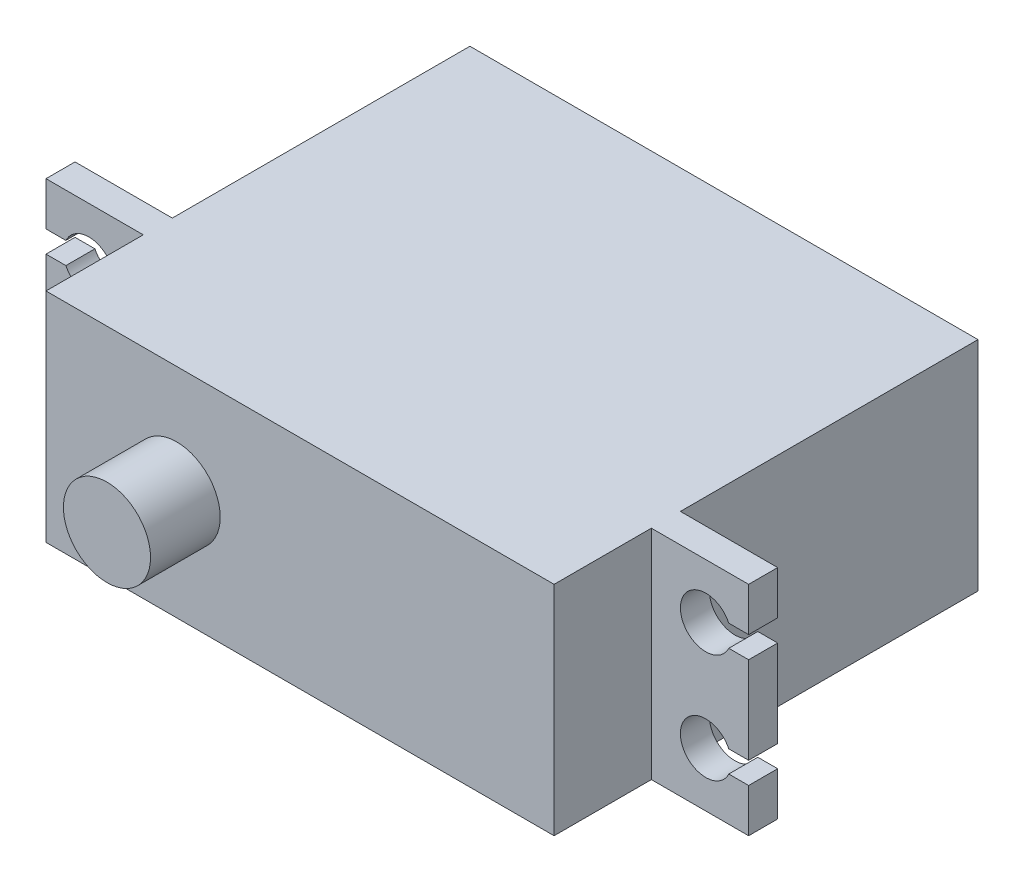
ISO-10303-21;
HEADER;
FILE_DESCRIPTION(('STEP AP214'),'2;1');
FILE_NAME('part.step','',(''),(''),'','','');
FILE_SCHEMA(('AUTOMOTIVE_DESIGN { 1 0 10303 214 1 1 1 1 }'));
ENDSEC;
DATA;
#1=APPLICATION_CONTEXT('core data for automotive mechanical design processes');
#2=APPLICATION_PROTOCOL_DEFINITION('international standard','automotive_design',2000,#1);
#3=PRODUCT_CONTEXT('',#1,'mechanical');
#4=PRODUCT('Part','Part','',(#3));
#5=PRODUCT_RELATED_PRODUCT_CATEGORY('part','',(#4));
#6=PRODUCT_DEFINITION_FORMATION('','',#4);
#7=PRODUCT_DEFINITION_CONTEXT('part definition',#1,'design');
#8=PRODUCT_DEFINITION('design','',#6,#7);
#9=PRODUCT_DEFINITION_SHAPE('','',#8);
#10=(LENGTH_UNIT() NAMED_UNIT(*) SI_UNIT(.MILLI.,.METRE.));
#11=(NAMED_UNIT(*) PLANE_ANGLE_UNIT() SI_UNIT($,.RADIAN.));
#12=(NAMED_UNIT(*) SI_UNIT($,.STERADIAN.) SOLID_ANGLE_UNIT());
#13=UNCERTAINTY_MEASURE_WITH_UNIT(LENGTH_MEASURE(1.E-05),#10,'distance_accuracy_value','');
#14=(GEOMETRIC_REPRESENTATION_CONTEXT(3) GLOBAL_UNCERTAINTY_ASSIGNED_CONTEXT((#13)) GLOBAL_UNIT_ASSIGNED_CONTEXT((#10,
#11,#12)) REPRESENTATION_CONTEXT('',''));
#15=CARTESIAN_POINT('',(0.,0.,0.));
#16=DIRECTION('',(0.,0.,1.));
#17=DIRECTION('',(1.,0.,0.));
#18=AXIS2_PLACEMENT_3D('',#15,#16,#17);
#19=CARTESIAN_POINT('',(-21.25,-3.75,22.5));
#20=DIRECTION('',(0.,0.,1.));
#21=DIRECTION('',(1.,0.,0.));
#22=AXIS2_PLACEMENT_3D('',#19,#20,#21);
#23=PLANE('',#22);
#24=DIRECTION('',(0.,1.,0.));
#25=VECTOR('',#24,1.);
#26=CARTESIAN_POINT('',(17.5,7.5,22.5));
#27=LINE('',#26,#25);
#28=CARTESIAN_POINT('',(17.5,-7.5,22.5));
#29=VERTEX_POINT('',#28);
#30=CARTESIAN_POINT('',(17.5,7.5,22.5));
#31=VERTEX_POINT('',#30);
#32=EDGE_CURVE('E48',#29,#31,#27,.T.);
#33=ORIENTED_EDGE('',*,*,#32,.F.);
#34=DIRECTION('',(1.,0.,0.));
#35=VECTOR('',#34,1.);
#36=CARTESIAN_POINT('',(-24.2,-7.5,22.5));
#37=LINE('',#36,#35);
#38=CARTESIAN_POINT('',(24.2,-7.5,22.5));
#39=VERTEX_POINT('',#38);
#40=EDGE_CURVE('E290',#29,#39,#37,.T.);
#41=ORIENTED_EDGE('',*,*,#40,.T.);
#42=DIRECTION('',(0.,1.,0.));
#43=VECTOR('',#42,1.);
#44=CARTESIAN_POINT('',(24.2,-4.5,22.5));
#45=LINE('',#44,#43);
#46=CARTESIAN_POINT('',(24.2,-4.5,22.5));
#47=VERTEX_POINT('',#46);
#48=EDGE_CURVE('E249',#39,#47,#45,.T.);
#49=ORIENTED_EDGE('',*,*,#48,.T.);
#50=DIRECTION('',(-1.,0.,0.));
#51=VECTOR('',#50,1.);
#52=CARTESIAN_POINT('',(24.2,-4.5,22.5));
#53=LINE('',#52,#51);
#54=CARTESIAN_POINT('',(22.8311388300842,-4.5,22.5));
#55=VERTEX_POINT('',#54);
#56=EDGE_CURVE('E252',#47,#55,#53,.T.);
#57=ORIENTED_EDGE('',*,*,#56,.T.);
#58=CARTESIAN_POINT('',(21.25,-3.75,22.5));
#59=DIRECTION('',(0.,0.,-1.));
#60=DIRECTION('',(1.,0.,0.));
#61=AXIS2_PLACEMENT_3D('',#58,#59,#60);
#62=CIRCLE('',#61,1.75);
#63=CARTESIAN_POINT('',(22.8311388300842,-3.,22.5));
#64=VERTEX_POINT('',#63);
#65=EDGE_CURVE('E255',#55,#64,#62,.T.);
#66=ORIENTED_EDGE('',*,*,#65,.T.);
#67=DIRECTION('',(1.,0.,0.));
#68=VECTOR('',#67,1.);
#69=CARTESIAN_POINT('',(24.2,-3.,22.5));
#70=LINE('',#69,#68);
#71=CARTESIAN_POINT('',(24.2,-3.,22.5));
#72=VERTEX_POINT('',#71);
#73=EDGE_CURVE('E257',#64,#72,#70,.T.);
#74=ORIENTED_EDGE('',*,*,#73,.T.);
#75=DIRECTION('',(0.,1.,0.));
#76=VECTOR('',#75,1.);
#77=CARTESIAN_POINT('',(24.2,3.,22.5));
#78=LINE('',#77,#76);
#79=CARTESIAN_POINT('',(24.2,3.,22.5));
#80=VERTEX_POINT('',#79);
#81=EDGE_CURVE('E259',#72,#80,#78,.T.);
#82=ORIENTED_EDGE('',*,*,#81,.T.);
#83=DIRECTION('',(-1.,0.,0.));
#84=VECTOR('',#83,1.);
#85=CARTESIAN_POINT('',(24.2,3.,22.5));
#86=LINE('',#85,#84);
#87=CARTESIAN_POINT('',(22.8311388300842,3.,22.5));
#88=VERTEX_POINT('',#87);
#89=EDGE_CURVE('E261',#80,#88,#86,.T.);
#90=ORIENTED_EDGE('',*,*,#89,.T.);
#91=CARTESIAN_POINT('',(21.25,3.75,22.5));
#92=DIRECTION('',(0.,0.,-1.));
#93=DIRECTION('',(1.,0.,0.));
#94=AXIS2_PLACEMENT_3D('',#91,#92,#93);
#95=CIRCLE('',#94,1.75);
#96=CARTESIAN_POINT('',(22.8311388300842,4.5,22.5));
#97=VERTEX_POINT('',#96);
#98=EDGE_CURVE('E263',#88,#97,#95,.T.);
#99=ORIENTED_EDGE('',*,*,#98,.T.);
#100=DIRECTION('',(1.,0.,0.));
#101=VECTOR('',#100,1.);
#102=CARTESIAN_POINT('',(24.2,4.5,22.5));
#103=LINE('',#102,#101);
#104=CARTESIAN_POINT('',(24.2,4.5,22.5));
#105=VERTEX_POINT('',#104);
#106=EDGE_CURVE('E265',#97,#105,#103,.T.);
#107=ORIENTED_EDGE('',*,*,#106,.T.);
#108=DIRECTION('',(0.,1.,0.));
#109=VECTOR('',#108,1.);
#110=CARTESIAN_POINT('',(24.2,7.5,22.5));
#111=LINE('',#110,#109);
#112=CARTESIAN_POINT('',(24.2,7.5,22.5));
#113=VERTEX_POINT('',#112);
#114=EDGE_CURVE('E267',#105,#113,#111,.T.);
#115=ORIENTED_EDGE('',*,*,#114,.T.);
#116=DIRECTION('',(-1.,0.,0.));
#117=VECTOR('',#116,1.);
#118=CARTESIAN_POINT('',(-24.2,7.5,22.5));
#119=LINE('',#118,#117);
#120=EDGE_CURVE('E270',#113,#31,#119,.T.);
#121=ORIENTED_EDGE('',*,*,#120,.T.);
#122=EDGE_LOOP('',(#33,#41,#49,#57,#66,#74,#82,#90,#99,#107,#115,#121));
#123=FACE_BOUND('',#122,.T.);
#124=ADVANCED_FACE('F33',(#123),#23,.T.);
#125=CARTESIAN_POINT('',(17.5,7.5,20.5));
#126=DIRECTION('',(-1.,0.,0.));
#127=DIRECTION('',(0.,0.,1.));
#128=AXIS2_PLACEMENT_3D('',#125,#126,#127);
#129=PLANE('',#128);
#130=DIRECTION('',(0.,1.,0.));
#131=VECTOR('',#130,1.);
#132=CARTESIAN_POINT('',(17.5,7.5,0.));
#133=LINE('',#132,#131);
#134=CARTESIAN_POINT('',(17.5,-7.5,0.));
#135=VERTEX_POINT('',#134);
#136=CARTESIAN_POINT('',(17.5,7.5,0.));
#137=VERTEX_POINT('',#136);
#138=EDGE_CURVE('E393',#135,#137,#133,.T.);
#139=ORIENTED_EDGE('',*,*,#138,.T.);
#140=DIRECTION('',(0.,0.,-1.));
#141=VECTOR('',#140,1.);
#142=CARTESIAN_POINT('',(17.5,7.5,20.5));
#143=LINE('',#142,#141);
#144=CARTESIAN_POINT('',(17.5,7.5,20.5));
#145=VERTEX_POINT('',#144);
#146=EDGE_CURVE('E11',#145,#137,#143,.T.);
#147=ORIENTED_EDGE('',*,*,#146,.F.);
#148=DIRECTION('',(0.,1.,0.));
#149=VECTOR('',#148,1.);
#150=CARTESIAN_POINT('',(17.5,7.5,20.5));
#151=LINE('',#150,#149);
#152=CARTESIAN_POINT('',(17.5,-7.5,20.5));
#153=VERTEX_POINT('',#152);
#154=EDGE_CURVE('E394',#153,#145,#151,.T.);
#155=ORIENTED_EDGE('',*,*,#154,.F.);
#156=DIRECTION('',(0.,0.,-1.));
#157=VECTOR('',#156,1.);
#158=CARTESIAN_POINT('',(17.5,-7.5,20.5));
#159=LINE('',#158,#157);
#160=EDGE_CURVE('E401',#153,#135,#159,.T.);
#161=ORIENTED_EDGE('',*,*,#160,.T.);
#162=EDGE_LOOP('',(#139,#147,#155,#161));
#163=FACE_BOUND('',#162,.T.);
#164=ADVANCED_FACE('F35',(#163),#129,.F.);
#165=CARTESIAN_POINT('',(-17.5,7.5,20.5));
#166=DIRECTION('',(0.,-1.,0.));
#167=DIRECTION('',(0.,0.,-1.));
#168=AXIS2_PLACEMENT_3D('',#165,#166,#167);
#169=PLANE('',#168);
#170=DIRECTION('',(-1.,0.,0.));
#171=VECTOR('',#170,1.);
#172=CARTESIAN_POINT('',(-17.5,7.5,0.));
#173=LINE('',#172,#171);
#174=CARTESIAN_POINT('',(-17.5,7.5,0.));
#175=VERTEX_POINT('',#174);
#176=EDGE_CURVE('E404',#137,#175,#173,.T.);
#177=ORIENTED_EDGE('',*,*,#176,.T.);
#178=DIRECTION('',(0.,0.,-1.));
#179=VECTOR('',#178,1.);
#180=CARTESIAN_POINT('',(-17.5,7.5,20.5));
#181=LINE('',#180,#179);
#182=CARTESIAN_POINT('',(-17.5,7.5,20.5));
#183=VERTEX_POINT('',#182);
#184=EDGE_CURVE('E41',#183,#175,#181,.T.);
#185=ORIENTED_EDGE('',*,*,#184,.F.);
#186=DIRECTION('',(-1.,0.,0.));
#187=VECTOR('',#186,1.);
#188=CARTESIAN_POINT('',(-24.2,7.5,20.5));
#189=LINE('',#188,#187);
#190=CARTESIAN_POINT('',(-24.2,7.5,20.5));
#191=VERTEX_POINT('',#190);
#192=EDGE_CURVE('E309',#183,#191,#189,.T.);
#193=ORIENTED_EDGE('',*,*,#192,.T.);
#194=DIRECTION('',(0.,0.,-1.));
#195=VECTOR('',#194,1.);
#196=CARTESIAN_POINT('',(-24.2,7.5,22.5));
#197=LINE('',#196,#195);
#198=CARTESIAN_POINT('',(-24.2,7.5,22.5));
#199=VERTEX_POINT('',#198);
#200=EDGE_CURVE('E363',#199,#191,#197,.T.);
#201=ORIENTED_EDGE('',*,*,#200,.F.);
#202=CARTESIAN_POINT('',(-17.5,7.5,22.5));
#203=VERTEX_POINT('',#202);
#204=EDGE_CURVE('E269',#203,#199,#119,.T.);
#205=ORIENTED_EDGE('',*,*,#204,.F.);
#206=DIRECTION('',(0.,0.,-1.));
#207=VECTOR('',#206,1.);
#208=CARTESIAN_POINT('',(-17.5,7.5,29.2));
#209=LINE('',#208,#207);
#210=CARTESIAN_POINT('',(-17.5,7.5,29.2));
#211=VERTEX_POINT('',#210);
#212=EDGE_CURVE('E225',#211,#203,#209,.T.);
#213=ORIENTED_EDGE('',*,*,#212,.F.);
#214=DIRECTION('',(-1.,0.,0.));
#215=VECTOR('',#214,1.);
#216=CARTESIAN_POINT('',(-17.5,7.5,29.2));
#217=LINE('',#216,#215);
#218=CARTESIAN_POINT('',(17.5,7.5,29.2));
#219=VERTEX_POINT('',#218);
#220=EDGE_CURVE('E218',#219,#211,#217,.T.);
#221=ORIENTED_EDGE('',*,*,#220,.F.);
#222=DIRECTION('',(0.,0.,-1.));
#223=VECTOR('',#222,1.);
#224=CARTESIAN_POINT('',(17.5,7.5,29.2));
#225=LINE('',#224,#223);
#226=EDGE_CURVE('E223',#219,#31,#225,.T.);
#227=ORIENTED_EDGE('',*,*,#226,.T.);
#228=ORIENTED_EDGE('',*,*,#120,.F.);
#229=DIRECTION('',(0.,0.,-1.));
#230=VECTOR('',#229,1.);
#231=CARTESIAN_POINT('',(24.2,7.5,22.5));
#232=LINE('',#231,#230);
#233=CARTESIAN_POINT('',(24.2,7.5,20.5));
#234=VERTEX_POINT('',#233);
#235=EDGE_CURVE('E366',#113,#234,#232,.T.);
#236=ORIENTED_EDGE('',*,*,#235,.T.);
#237=EDGE_CURVE('E310',#234,#145,#189,.T.);
#238=ORIENTED_EDGE('',*,*,#237,.T.);
#239=ORIENTED_EDGE('',*,*,#146,.T.);
#240=EDGE_LOOP('',(#177,#185,#193,#201,#205,#213,#221,#227,#228,#236,#238,#239));
#241=FACE_BOUND('',#240,.T.);
#242=ADVANCED_FACE('F220',(#241),#169,.F.);
#243=CARTESIAN_POINT('',(-17.5,7.5,20.5));
#244=DIRECTION('',(1.,0.,0.));
#245=DIRECTION('',(0.,1.,0.));
#246=AXIS2_PLACEMENT_3D('',#243,#244,#245);
#247=PLANE('',#246);
#248=DIRECTION('',(0.,-1.,0.));
#249=VECTOR('',#248,1.);
#250=CARTESIAN_POINT('',(-17.5,7.5,0.));
#251=LINE('',#250,#249);
#252=CARTESIAN_POINT('',(-17.5,-7.5,0.));
#253=VERTEX_POINT('',#252);
#254=EDGE_CURVE('E406',#175,#253,#251,.T.);
#255=ORIENTED_EDGE('',*,*,#254,.T.);
#256=DIRECTION('',(0.,0.,-1.));
#257=VECTOR('',#256,1.);
#258=CARTESIAN_POINT('',(-17.5,-7.5,20.5));
#259=LINE('',#258,#257);
#260=CARTESIAN_POINT('',(-17.5,-7.5,20.5));
#261=VERTEX_POINT('',#260);
#262=EDGE_CURVE('E411',#261,#253,#259,.T.);
#263=ORIENTED_EDGE('',*,*,#262,.F.);
#264=DIRECTION('',(0.,-1.,0.));
#265=VECTOR('',#264,1.);
#266=CARTESIAN_POINT('',(-17.5,7.5,20.5));
#267=LINE('',#266,#265);
#268=EDGE_CURVE('E397',#183,#261,#267,.T.);
#269=ORIENTED_EDGE('',*,*,#268,.F.);
#270=ORIENTED_EDGE('',*,*,#184,.T.);
#271=EDGE_LOOP('',(#255,#263,#269,#270));
#272=FACE_BOUND('',#271,.T.);
#273=ADVANCED_FACE('F417',(#272),#247,.F.);
#274=CARTESIAN_POINT('',(-17.5,-7.5,20.5));
#275=DIRECTION('',(0.,1.,0.));
#276=DIRECTION('',(0.,0.,1.));
#277=AXIS2_PLACEMENT_3D('',#274,#275,#276);
#278=PLANE('',#277);
#279=DIRECTION('',(1.,0.,0.));
#280=VECTOR('',#279,1.);
#281=CARTESIAN_POINT('',(-17.5,-7.5,0.));
#282=LINE('',#281,#280);
#283=EDGE_CURVE('E398',#253,#135,#282,.T.);
#284=ORIENTED_EDGE('',*,*,#283,.T.);
#285=ORIENTED_EDGE('',*,*,#160,.F.);
#286=DIRECTION('',(1.,0.,0.));
#287=VECTOR('',#286,1.);
#288=CARTESIAN_POINT('',(-24.2,-7.5,20.5));
#289=LINE('',#288,#287);
#290=CARTESIAN_POINT('',(24.2,-7.5,20.5));
#291=VERTEX_POINT('',#290);
#292=EDGE_CURVE('E331',#153,#291,#289,.T.);
#293=ORIENTED_EDGE('',*,*,#292,.T.);
#294=DIRECTION('',(0.,0.,-1.));
#295=VECTOR('',#294,1.);
#296=CARTESIAN_POINT('',(24.2,-7.5,22.5));
#297=LINE('',#296,#295);
#298=EDGE_CURVE('E292',#39,#291,#297,.T.);
#299=ORIENTED_EDGE('',*,*,#298,.F.);
#300=ORIENTED_EDGE('',*,*,#40,.F.);
#301=DIRECTION('',(0.,0.,-1.));
#302=VECTOR('',#301,1.);
#303=CARTESIAN_POINT('',(17.5,-7.5,29.2));
#304=LINE('',#303,#302);
#305=CARTESIAN_POINT('',(17.5,-7.5,29.2));
#306=VERTEX_POINT('',#305);
#307=EDGE_CURVE('E438',#306,#29,#304,.T.);
#308=ORIENTED_EDGE('',*,*,#307,.F.);
#309=DIRECTION('',(1.,0.,0.));
#310=VECTOR('',#309,1.);
#311=CARTESIAN_POINT('',(-17.5,-7.5,29.2));
#312=LINE('',#311,#310);
#313=CARTESIAN_POINT('',(-17.5,-7.5,29.2));
#314=VERTEX_POINT('',#313);
#315=EDGE_CURVE('E234',#314,#306,#312,.T.);
#316=ORIENTED_EDGE('',*,*,#315,.F.);
#317=DIRECTION('',(0.,0.,-1.));
#318=VECTOR('',#317,1.);
#319=CARTESIAN_POINT('',(-17.5,-7.5,29.2));
#320=LINE('',#319,#318);
#321=CARTESIAN_POINT('',(-17.5,-7.5,22.5));
#322=VERTEX_POINT('',#321);
#323=EDGE_CURVE('E245',#314,#322,#320,.T.);
#324=ORIENTED_EDGE('',*,*,#323,.T.);
#325=CARTESIAN_POINT('',(-24.2,-7.5,22.5));
#326=VERTEX_POINT('',#325);
#327=EDGE_CURVE('E291',#326,#322,#37,.T.);
#328=ORIENTED_EDGE('',*,*,#327,.F.);
#329=DIRECTION('',(0.,0.,-1.));
#330=VECTOR('',#329,1.);
#331=CARTESIAN_POINT('',(-24.2,-7.5,22.5));
#332=LINE('',#331,#330);
#333=CARTESIAN_POINT('',(-24.2,-7.5,20.5));
#334=VERTEX_POINT('',#333);
#335=EDGE_CURVE('E336',#326,#334,#332,.T.);
#336=ORIENTED_EDGE('',*,*,#335,.T.);
#337=EDGE_CURVE('E253',#334,#261,#289,.T.);
#338=ORIENTED_EDGE('',*,*,#337,.T.);
#339=ORIENTED_EDGE('',*,*,#262,.T.);
#340=EDGE_LOOP('',(#284,#285,#293,#299,#300,#308,#316,#324,#328,#336,#338,#339));
#341=FACE_BOUND('',#340,.T.);
#342=ADVANCED_FACE('F424',(#341),#278,.F.);
#343=CARTESIAN_POINT('',(0.,0.,0.));
#344=DIRECTION('',(0.,0.,1.));
#345=DIRECTION('',(1.,0.,0.));
#346=AXIS2_PLACEMENT_3D('',#343,#344,#345);
#347=PLANE('',#346);
#348=ORIENTED_EDGE('',*,*,#138,.F.);
#349=ORIENTED_EDGE('',*,*,#283,.F.);
#350=ORIENTED_EDGE('',*,*,#254,.F.);
#351=ORIENTED_EDGE('',*,*,#176,.F.);
#352=EDGE_LOOP('',(#348,#349,#350,#351));
#353=FACE_BOUND('',#352,.T.);
#354=ADVANCED_FACE('F422',(#353),#347,.F.);
#355=CARTESIAN_POINT('',(-21.25,-3.75,20.5));
#356=DIRECTION('',(0.,0.,1.));
#357=DIRECTION('',(1.,0.,0.));
#358=AXIS2_PLACEMENT_3D('',#355,#356,#357);
#359=PLANE('',#358);
#360=ORIENTED_EDGE('',*,*,#292,.F.);
#361=ORIENTED_EDGE('',*,*,#154,.T.);
#362=ORIENTED_EDGE('',*,*,#237,.F.);
#363=DIRECTION('',(0.,1.,0.));
#364=VECTOR('',#363,1.);
#365=CARTESIAN_POINT('',(24.2,7.5,20.5));
#366=LINE('',#365,#364);
#367=CARTESIAN_POINT('',(24.2,4.5,20.5));
#368=VERTEX_POINT('',#367);
#369=EDGE_CURVE('E307',#368,#234,#366,.T.);
#370=ORIENTED_EDGE('',*,*,#369,.F.);
#371=DIRECTION('',(1.,0.,0.));
#372=VECTOR('',#371,1.);
#373=CARTESIAN_POINT('',(24.2,4.5,20.5));
#374=LINE('',#373,#372);
#375=CARTESIAN_POINT('',(22.8311388300842,4.5,20.5));
#376=VERTEX_POINT('',#375);
#377=EDGE_CURVE('E305',#376,#368,#374,.T.);
#378=ORIENTED_EDGE('',*,*,#377,.F.);
#379=CARTESIAN_POINT('',(21.25,3.75,20.5));
#380=DIRECTION('',(0.,0.,-1.));
#381=DIRECTION('',(1.,0.,0.));
#382=AXIS2_PLACEMENT_3D('',#379,#380,#381);
#383=CIRCLE('',#382,1.75);
#384=CARTESIAN_POINT('',(22.8311388300842,3.,20.5));
#385=VERTEX_POINT('',#384);
#386=EDGE_CURVE('E303',#385,#376,#383,.T.);
#387=ORIENTED_EDGE('',*,*,#386,.F.);
#388=DIRECTION('',(-1.,0.,0.));
#389=VECTOR('',#388,1.);
#390=CARTESIAN_POINT('',(24.2,3.,20.5));
#391=LINE('',#390,#389);
#392=CARTESIAN_POINT('',(24.2,3.,20.5));
#393=VERTEX_POINT('',#392);
#394=EDGE_CURVE('E301',#393,#385,#391,.T.);
#395=ORIENTED_EDGE('',*,*,#394,.F.);
#396=DIRECTION('',(0.,1.,0.));
#397=VECTOR('',#396,1.);
#398=CARTESIAN_POINT('',(24.2,3.,20.5));
#399=LINE('',#398,#397);
#400=CARTESIAN_POINT('',(24.2,-3.,20.5));
#401=VERTEX_POINT('',#400);
#402=EDGE_CURVE('E299',#401,#393,#399,.T.);
#403=ORIENTED_EDGE('',*,*,#402,.F.);
#404=DIRECTION('',(1.,0.,0.));
#405=VECTOR('',#404,1.);
#406=CARTESIAN_POINT('',(24.2,-3.,20.5));
#407=LINE('',#406,#405);
#408=CARTESIAN_POINT('',(22.8311388300842,-3.,20.5));
#409=VERTEX_POINT('',#408);
#410=EDGE_CURVE('E297',#409,#401,#407,.T.);
#411=ORIENTED_EDGE('',*,*,#410,.F.);
#412=CARTESIAN_POINT('',(21.25,-3.75,20.5));
#413=DIRECTION('',(0.,0.,-1.));
#414=DIRECTION('',(1.,0.,0.));
#415=AXIS2_PLACEMENT_3D('',#412,#413,#414);
#416=CIRCLE('',#415,1.75);
#417=CARTESIAN_POINT('',(22.8311388300842,-4.5,20.5));
#418=VERTEX_POINT('',#417);
#419=EDGE_CURVE('E295',#418,#409,#416,.T.);
#420=ORIENTED_EDGE('',*,*,#419,.F.);
#421=DIRECTION('',(-1.,0.,0.));
#422=VECTOR('',#421,1.);
#423=CARTESIAN_POINT('',(24.2,-4.5,20.5));
#424=LINE('',#423,#422);
#425=CARTESIAN_POINT('',(24.2,-4.5,20.5));
#426=VERTEX_POINT('',#425);
#427=EDGE_CURVE('E243',#426,#418,#424,.T.);
#428=ORIENTED_EDGE('',*,*,#427,.F.);
#429=DIRECTION('',(0.,1.,0.));
#430=VECTOR('',#429,1.);
#431=CARTESIAN_POINT('',(24.2,-4.5,20.5));
#432=LINE('',#431,#430);
#433=EDGE_CURVE('E240',#291,#426,#432,.T.);
#434=ORIENTED_EDGE('',*,*,#433,.F.);
#435=EDGE_LOOP('',(#360,#361,#362,#370,#378,#387,#395,#403,#411,#420,#428,#434));
#436=FACE_BOUND('',#435,.T.);
#437=ADVANCED_FACE('F431',(#436),#359,.F.);
#438=ORIENTED_EDGE('',*,*,#192,.F.);
#439=ORIENTED_EDGE('',*,*,#268,.T.);
#440=ORIENTED_EDGE('',*,*,#337,.F.);
#441=DIRECTION('',(0.,-1.,0.));
#442=VECTOR('',#441,1.);
#443=CARTESIAN_POINT('',(-24.2,-4.5,20.5));
#444=LINE('',#443,#442);
#445=CARTESIAN_POINT('',(-24.2,-4.5,20.5));
#446=VERTEX_POINT('',#445);
#447=EDGE_CURVE('E329',#446,#334,#444,.T.);
#448=ORIENTED_EDGE('',*,*,#447,.F.);
#449=DIRECTION('',(-1.,0.,0.));
#450=VECTOR('',#449,1.);
#451=CARTESIAN_POINT('',(-24.2,-4.5,20.5));
#452=LINE('',#451,#450);
#453=CARTESIAN_POINT('',(-22.8311388300842,-4.5,20.5));
#454=VERTEX_POINT('',#453);
#455=EDGE_CURVE('E327',#454,#446,#452,.T.);
#456=ORIENTED_EDGE('',*,*,#455,.F.);
#457=CARTESIAN_POINT('',(-21.25,-3.75,20.5));
#458=DIRECTION('',(0.,0.,-1.));
#459=DIRECTION('',(1.,0.,0.));
#460=AXIS2_PLACEMENT_3D('',#457,#458,#459);
#461=CIRCLE('',#460,1.75);
#462=CARTESIAN_POINT('',(-22.8311388300842,-3.,20.5));
#463=VERTEX_POINT('',#462);
#464=EDGE_CURVE('E325',#463,#454,#461,.T.);
#465=ORIENTED_EDGE('',*,*,#464,.F.);
#466=DIRECTION('',(1.,0.,0.));
#467=VECTOR('',#466,1.);
#468=CARTESIAN_POINT('',(-24.2,-3.,20.5));
#469=LINE('',#468,#467);
#470=CARTESIAN_POINT('',(-24.2,-3.,20.5));
#471=VERTEX_POINT('',#470);
#472=EDGE_CURVE('E323',#471,#463,#469,.T.);
#473=ORIENTED_EDGE('',*,*,#472,.F.);
#474=DIRECTION('',(0.,-1.,0.));
#475=VECTOR('',#474,1.);
#476=CARTESIAN_POINT('',(-24.2,3.,20.5));
#477=LINE('',#476,#475);
#478=CARTESIAN_POINT('',(-24.2,3.,20.5));
#479=VERTEX_POINT('',#478);
#480=EDGE_CURVE('E321',#479,#471,#477,.T.);
#481=ORIENTED_EDGE('',*,*,#480,.F.);
#482=DIRECTION('',(-1.,0.,0.));
#483=VECTOR('',#482,1.);
#484=CARTESIAN_POINT('',(-24.2,3.,20.5));
#485=LINE('',#484,#483);
#486=CARTESIAN_POINT('',(-22.8311388300842,3.,20.5));
#487=VERTEX_POINT('',#486);
#488=EDGE_CURVE('E319',#487,#479,#485,.T.);
#489=ORIENTED_EDGE('',*,*,#488,.F.);
#490=CARTESIAN_POINT('',(-21.25,3.75,20.5));
#491=DIRECTION('',(0.,0.,-1.));
#492=DIRECTION('',(1.,0.,0.));
#493=AXIS2_PLACEMENT_3D('',#490,#491,#492);
#494=CIRCLE('',#493,1.75);
#495=CARTESIAN_POINT('',(-22.8311388300842,4.5,20.5));
#496=VERTEX_POINT('',#495);
#497=EDGE_CURVE('E317',#496,#487,#494,.T.);
#498=ORIENTED_EDGE('',*,*,#497,.F.);
#499=DIRECTION('',(1.,0.,0.));
#500=VECTOR('',#499,1.);
#501=CARTESIAN_POINT('',(-24.2,4.5,20.5));
#502=LINE('',#501,#500);
#503=CARTESIAN_POINT('',(-24.2,4.5,20.5));
#504=VERTEX_POINT('',#503);
#505=EDGE_CURVE('E315',#504,#496,#502,.T.);
#506=ORIENTED_EDGE('',*,*,#505,.F.);
#507=DIRECTION('',(0.,-1.,0.));
#508=VECTOR('',#507,1.);
#509=CARTESIAN_POINT('',(-24.2,7.5,20.5));
#510=LINE('',#509,#508);
#511=EDGE_CURVE('E313',#191,#504,#510,.T.);
#512=ORIENTED_EDGE('',*,*,#511,.F.);
#513=EDGE_LOOP('',(#438,#439,#440,#448,#456,#465,#473,#481,#489,#498,#506,#512));
#514=FACE_BOUND('',#513,.T.);
#515=ADVANCED_FACE('F554',(#514),#359,.F.);
#516=CARTESIAN_POINT('',(24.2,-4.5,22.5));
#517=DIRECTION('',(-1.,0.,0.));
#518=DIRECTION('',(0.,0.,1.));
#519=AXIS2_PLACEMENT_3D('',#516,#517,#518);
#520=PLANE('',#519);
#521=ORIENTED_EDGE('',*,*,#433,.T.);
#522=DIRECTION('',(0.,0.,-1.));
#523=VECTOR('',#522,1.);
#524=CARTESIAN_POINT('',(24.2,-4.5,22.5));
#525=LINE('',#524,#523);
#526=EDGE_CURVE('E390',#47,#426,#525,.T.);
#527=ORIENTED_EDGE('',*,*,#526,.F.);
#528=ORIENTED_EDGE('',*,*,#48,.F.);
#529=ORIENTED_EDGE('',*,*,#298,.T.);
#530=EDGE_LOOP('',(#521,#527,#528,#529));
#531=FACE_BOUND('',#530,.T.);
#532=ADVANCED_FACE('F435',(#531),#520,.F.);
#533=CARTESIAN_POINT('',(24.2,-4.5,22.5));
#534=DIRECTION('',(0.,-1.,0.));
#535=DIRECTION('',(1.,0.,0.));
#536=AXIS2_PLACEMENT_3D('',#533,#534,#535);
#537=PLANE('',#536);
#538=ORIENTED_EDGE('',*,*,#427,.T.);
#539=DIRECTION('',(0.,0.,-1.));
#540=VECTOR('',#539,1.);
#541=CARTESIAN_POINT('',(22.8311388300842,-4.5,22.5));
#542=LINE('',#541,#540);
#543=EDGE_CURVE('E387',#55,#418,#542,.T.);
#544=ORIENTED_EDGE('',*,*,#543,.F.);
#545=ORIENTED_EDGE('',*,*,#56,.F.);
#546=ORIENTED_EDGE('',*,*,#526,.T.);
#547=EDGE_LOOP('',(#538,#544,#545,#546));
#548=FACE_BOUND('',#547,.T.);
#549=ADVANCED_FACE('F547',(#548),#537,.F.);
#550=CARTESIAN_POINT('',(21.25,-3.75,22.5));
#551=DIRECTION('',(0.,0.,-1.));
#552=DIRECTION('',(-1.,0.,0.));
#553=AXIS2_PLACEMENT_3D('',#550,#551,#552);
#554=CYLINDRICAL_SURFACE('',#553,1.75);
#555=ORIENTED_EDGE('',*,*,#419,.T.);
#556=DIRECTION('',(0.,0.,-1.));
#557=VECTOR('',#556,1.);
#558=CARTESIAN_POINT('',(22.8311388300842,-3.,22.5));
#559=LINE('',#558,#557);
#560=EDGE_CURVE('E384',#64,#409,#559,.T.);
#561=ORIENTED_EDGE('',*,*,#560,.F.);
#562=ORIENTED_EDGE('',*,*,#65,.F.);
#563=ORIENTED_EDGE('',*,*,#543,.T.);
#564=EDGE_LOOP('',(#555,#561,#562,#563));
#565=FACE_BOUND('',#564,.T.);
#566=ADVANCED_FACE('F543',(#565),#554,.F.);
#567=CARTESIAN_POINT('',(24.2,-3.,22.5));
#568=DIRECTION('',(0.,1.,0.));
#569=DIRECTION('',(0.,0.,1.));
#570=AXIS2_PLACEMENT_3D('',#567,#568,#569);
#571=PLANE('',#570);
#572=ORIENTED_EDGE('',*,*,#410,.T.);
#573=DIRECTION('',(0.,0.,-1.));
#574=VECTOR('',#573,1.);
#575=CARTESIAN_POINT('',(24.2,-3.,22.5));
#576=LINE('',#575,#574);
#577=EDGE_CURVE('E381',#72,#401,#576,.T.);
#578=ORIENTED_EDGE('',*,*,#577,.F.);
#579=ORIENTED_EDGE('',*,*,#73,.F.);
#580=ORIENTED_EDGE('',*,*,#560,.T.);
#581=EDGE_LOOP('',(#572,#578,#579,#580));
#582=FACE_BOUND('',#581,.T.);
#583=ADVANCED_FACE('F539',(#582),#571,.F.);
#584=CARTESIAN_POINT('',(24.2,3.,22.5));
#585=DIRECTION('',(-1.,0.,0.));
#586=DIRECTION('',(0.,0.,1.));
#587=AXIS2_PLACEMENT_3D('',#584,#585,#586);
#588=PLANE('',#587);
#589=ORIENTED_EDGE('',*,*,#402,.T.);
#590=DIRECTION('',(0.,0.,-1.));
#591=VECTOR('',#590,1.);
#592=CARTESIAN_POINT('',(24.2,3.,22.5));
#593=LINE('',#592,#591);
#594=EDGE_CURVE('E378',#80,#393,#593,.T.);
#595=ORIENTED_EDGE('',*,*,#594,.F.);
#596=ORIENTED_EDGE('',*,*,#81,.F.);
#597=ORIENTED_EDGE('',*,*,#577,.T.);
#598=EDGE_LOOP('',(#589,#595,#596,#597));
#599=FACE_BOUND('',#598,.T.);
#600=ADVANCED_FACE('F535',(#599),#588,.F.);
#601=CARTESIAN_POINT('',(24.2,3.,22.5));
#602=DIRECTION('',(0.,-1.,0.));
#603=DIRECTION('',(0.,0.,-1.));
#604=AXIS2_PLACEMENT_3D('',#601,#602,#603);
#605=PLANE('',#604);
#606=ORIENTED_EDGE('',*,*,#394,.T.);
#607=DIRECTION('',(0.,0.,-1.));
#608=VECTOR('',#607,1.);
#609=CARTESIAN_POINT('',(22.8311388300842,3.,22.5));
#610=LINE('',#609,#608);
#611=EDGE_CURVE('E375',#88,#385,#610,.T.);
#612=ORIENTED_EDGE('',*,*,#611,.F.);
#613=ORIENTED_EDGE('',*,*,#89,.F.);
#614=ORIENTED_EDGE('',*,*,#594,.T.);
#615=EDGE_LOOP('',(#606,#612,#613,#614));
#616=FACE_BOUND('',#615,.T.);
#617=ADVANCED_FACE('F531',(#616),#605,.F.);
#618=CARTESIAN_POINT('',(21.25,3.75,22.5));
#619=DIRECTION('',(0.,0.,-1.));
#620=DIRECTION('',(-1.,0.,0.));
#621=AXIS2_PLACEMENT_3D('',#618,#619,#620);
#622=CYLINDRICAL_SURFACE('',#621,1.75);
#623=ORIENTED_EDGE('',*,*,#386,.T.);
#624=DIRECTION('',(0.,0.,-1.));
#625=VECTOR('',#624,1.);
#626=CARTESIAN_POINT('',(22.8311388300842,4.5,22.5));
#627=LINE('',#626,#625);
#628=EDGE_CURVE('E372',#97,#376,#627,.T.);
#629=ORIENTED_EDGE('',*,*,#628,.F.);
#630=ORIENTED_EDGE('',*,*,#98,.F.);
#631=ORIENTED_EDGE('',*,*,#611,.T.);
#632=EDGE_LOOP('',(#623,#629,#630,#631));
#633=FACE_BOUND('',#632,.T.);
#634=ADVANCED_FACE('F527',(#633),#622,.F.);
#635=CARTESIAN_POINT('',(24.2,4.5,22.5));
#636=DIRECTION('',(0.,1.,0.));
#637=DIRECTION('',(0.,0.,1.));
#638=AXIS2_PLACEMENT_3D('',#635,#636,#637);
#639=PLANE('',#638);
#640=ORIENTED_EDGE('',*,*,#377,.T.);
#641=DIRECTION('',(0.,0.,-1.));
#642=VECTOR('',#641,1.);
#643=CARTESIAN_POINT('',(24.2,4.5,22.5));
#644=LINE('',#643,#642);
#645=EDGE_CURVE('E369',#105,#368,#644,.T.);
#646=ORIENTED_EDGE('',*,*,#645,.F.);
#647=ORIENTED_EDGE('',*,*,#106,.F.);
#648=ORIENTED_EDGE('',*,*,#628,.T.);
#649=EDGE_LOOP('',(#640,#646,#647,#648));
#650=FACE_BOUND('',#649,.T.);
#651=ADVANCED_FACE('F523',(#650),#639,.F.);
#652=CARTESIAN_POINT('',(24.2,7.5,22.5));
#653=DIRECTION('',(-1.,0.,0.));
#654=DIRECTION('',(0.,0.,1.));
#655=AXIS2_PLACEMENT_3D('',#652,#653,#654);
#656=PLANE('',#655);
#657=ORIENTED_EDGE('',*,*,#369,.T.);
#658=ORIENTED_EDGE('',*,*,#235,.F.);
#659=ORIENTED_EDGE('',*,*,#114,.F.);
#660=ORIENTED_EDGE('',*,*,#645,.T.);
#661=EDGE_LOOP('',(#657,#658,#659,#660));
#662=FACE_BOUND('',#661,.T.);
#663=ADVANCED_FACE('F519',(#662),#656,.F.);
#664=CARTESIAN_POINT('',(-24.2,7.5,22.5));
#665=DIRECTION('',(1.,0.,0.));
#666=DIRECTION('',(0.,0.,-1.));
#667=AXIS2_PLACEMENT_3D('',#664,#665,#666);
#668=PLANE('',#667);
#669=ORIENTED_EDGE('',*,*,#511,.T.);
#670=DIRECTION('',(0.,0.,-1.));
#671=VECTOR('',#670,1.);
#672=CARTESIAN_POINT('',(-24.2,4.5,22.5));
#673=LINE('',#672,#671);
#674=CARTESIAN_POINT('',(-24.2,4.5,22.5));
#675=VERTEX_POINT('',#674);
#676=EDGE_CURVE('E360',#675,#504,#673,.T.);
#677=ORIENTED_EDGE('',*,*,#676,.F.);
#678=DIRECTION('',(0.,-1.,0.));
#679=VECTOR('',#678,1.);
#680=CARTESIAN_POINT('',(-24.2,7.5,22.5));
#681=LINE('',#680,#679);
#682=EDGE_CURVE('E272',#199,#675,#681,.T.);
#683=ORIENTED_EDGE('',*,*,#682,.F.);
#684=ORIENTED_EDGE('',*,*,#200,.T.);
#685=EDGE_LOOP('',(#669,#677,#683,#684));
#686=FACE_BOUND('',#685,.T.);
#687=ADVANCED_FACE('F515',(#686),#668,.F.);
#688=CARTESIAN_POINT('',(-24.2,4.5,22.5));
#689=DIRECTION('',(0.,1.,0.));
#690=DIRECTION('',(0.,0.,1.));
#691=AXIS2_PLACEMENT_3D('',#688,#689,#690);
#692=PLANE('',#691);
#693=ORIENTED_EDGE('',*,*,#505,.T.);
#694=DIRECTION('',(0.,0.,-1.));
#695=VECTOR('',#694,1.);
#696=CARTESIAN_POINT('',(-22.8311388300842,4.5,22.5));
#697=LINE('',#696,#695);
#698=CARTESIAN_POINT('',(-22.8311388300842,4.5,22.5));
#699=VERTEX_POINT('',#698);
#700=EDGE_CURVE('E357',#699,#496,#697,.T.);
#701=ORIENTED_EDGE('',*,*,#700,.F.);
#702=DIRECTION('',(1.,0.,0.));
#703=VECTOR('',#702,1.);
#704=CARTESIAN_POINT('',(-24.2,4.5,22.5));
#705=LINE('',#704,#703);
#706=EDGE_CURVE('E274',#675,#699,#705,.T.);
#707=ORIENTED_EDGE('',*,*,#706,.F.);
#708=ORIENTED_EDGE('',*,*,#676,.T.);
#709=EDGE_LOOP('',(#693,#701,#707,#708));
#710=FACE_BOUND('',#709,.T.);
#711=ADVANCED_FACE('F511',(#710),#692,.F.);
#712=CARTESIAN_POINT('',(-21.25,3.75,22.5));
#713=DIRECTION('',(0.,0.,-1.));
#714=DIRECTION('',(-1.,0.,0.));
#715=AXIS2_PLACEMENT_3D('',#712,#713,#714);
#716=CYLINDRICAL_SURFACE('',#715,1.75);
#717=ORIENTED_EDGE('',*,*,#497,.T.);
#718=DIRECTION('',(0.,0.,-1.));
#719=VECTOR('',#718,1.);
#720=CARTESIAN_POINT('',(-22.8311388300842,3.,22.5));
#721=LINE('',#720,#719);
#722=CARTESIAN_POINT('',(-22.8311388300842,3.,22.5));
#723=VERTEX_POINT('',#722);
#724=EDGE_CURVE('E354',#723,#487,#721,.T.);
#725=ORIENTED_EDGE('',*,*,#724,.F.);
#726=CARTESIAN_POINT('',(-21.25,3.75,22.5));
#727=DIRECTION('',(0.,0.,-1.));
#728=DIRECTION('',(1.,0.,0.));
#729=AXIS2_PLACEMENT_3D('',#726,#727,#728);
#730=CIRCLE('',#729,1.75);
#731=EDGE_CURVE('E276',#699,#723,#730,.T.);
#732=ORIENTED_EDGE('',*,*,#731,.F.);
#733=ORIENTED_EDGE('',*,*,#700,.T.);
#734=EDGE_LOOP('',(#717,#725,#732,#733));
#735=FACE_BOUND('',#734,.T.);
#736=ADVANCED_FACE('F507',(#735),#716,.F.);
#737=CARTESIAN_POINT('',(-24.2,3.,22.5));
#738=DIRECTION('',(0.,-1.,0.));
#739=DIRECTION('',(1.,0.,0.));
#740=AXIS2_PLACEMENT_3D('',#737,#738,#739);
#741=PLANE('',#740);
#742=ORIENTED_EDGE('',*,*,#488,.T.);
#743=DIRECTION('',(0.,0.,-1.));
#744=VECTOR('',#743,1.);
#745=CARTESIAN_POINT('',(-24.2,3.,22.5));
#746=LINE('',#745,#744);
#747=CARTESIAN_POINT('',(-24.2,3.,22.5));
#748=VERTEX_POINT('',#747);
#749=EDGE_CURVE('E351',#748,#479,#746,.T.);
#750=ORIENTED_EDGE('',*,*,#749,.F.);
#751=DIRECTION('',(-1.,0.,0.));
#752=VECTOR('',#751,1.);
#753=CARTESIAN_POINT('',(-24.2,3.,22.5));
#754=LINE('',#753,#752);
#755=EDGE_CURVE('E278',#723,#748,#754,.T.);
#756=ORIENTED_EDGE('',*,*,#755,.F.);
#757=ORIENTED_EDGE('',*,*,#724,.T.);
#758=EDGE_LOOP('',(#742,#750,#756,#757));
#759=FACE_BOUND('',#758,.T.);
#760=ADVANCED_FACE('F503',(#759),#741,.F.);
#761=CARTESIAN_POINT('',(-24.2,3.,22.5));
#762=DIRECTION('',(1.,0.,0.));
#763=DIRECTION('',(0.,0.,-1.));
#764=AXIS2_PLACEMENT_3D('',#761,#762,#763);
#765=PLANE('',#764);
#766=ORIENTED_EDGE('',*,*,#480,.T.);
#767=DIRECTION('',(0.,0.,-1.));
#768=VECTOR('',#767,1.);
#769=CARTESIAN_POINT('',(-24.2,-3.,22.5));
#770=LINE('',#769,#768);
#771=CARTESIAN_POINT('',(-24.2,-3.,22.5));
#772=VERTEX_POINT('',#771);
#773=EDGE_CURVE('E348',#772,#471,#770,.T.);
#774=ORIENTED_EDGE('',*,*,#773,.F.);
#775=DIRECTION('',(0.,-1.,0.));
#776=VECTOR('',#775,1.);
#777=CARTESIAN_POINT('',(-24.2,3.,22.5));
#778=LINE('',#777,#776);
#779=EDGE_CURVE('E280',#748,#772,#778,.T.);
#780=ORIENTED_EDGE('',*,*,#779,.F.);
#781=ORIENTED_EDGE('',*,*,#749,.T.);
#782=EDGE_LOOP('',(#766,#774,#780,#781));
#783=FACE_BOUND('',#782,.T.);
#784=ADVANCED_FACE('F499',(#783),#765,.F.);
#785=CARTESIAN_POINT('',(-24.2,-3.,22.5));
#786=DIRECTION('',(0.,1.,0.));
#787=DIRECTION('',(-1.,0.,0.));
#788=AXIS2_PLACEMENT_3D('',#785,#786,#787);
#789=PLANE('',#788);
#790=ORIENTED_EDGE('',*,*,#472,.T.);
#791=DIRECTION('',(0.,0.,-1.));
#792=VECTOR('',#791,1.);
#793=CARTESIAN_POINT('',(-22.8311388300842,-3.,22.5));
#794=LINE('',#793,#792);
#795=CARTESIAN_POINT('',(-22.8311388300842,-3.,22.5));
#796=VERTEX_POINT('',#795);
#797=EDGE_CURVE('E345',#796,#463,#794,.T.);
#798=ORIENTED_EDGE('',*,*,#797,.F.);
#799=DIRECTION('',(1.,0.,0.));
#800=VECTOR('',#799,1.);
#801=CARTESIAN_POINT('',(-24.2,-3.,22.5));
#802=LINE('',#801,#800);
#803=EDGE_CURVE('E282',#772,#796,#802,.T.);
#804=ORIENTED_EDGE('',*,*,#803,.F.);
#805=ORIENTED_EDGE('',*,*,#773,.T.);
#806=EDGE_LOOP('',(#790,#798,#804,#805));
#807=FACE_BOUND('',#806,.T.);
#808=ADVANCED_FACE('F495',(#807),#789,.F.);
#809=CARTESIAN_POINT('',(-21.25,-3.75,22.5));
#810=DIRECTION('',(0.,0.,-1.));
#811=DIRECTION('',(-1.,0.,0.));
#812=AXIS2_PLACEMENT_3D('',#809,#810,#811);
#813=CYLINDRICAL_SURFACE('',#812,1.75);
#814=ORIENTED_EDGE('',*,*,#464,.T.);
#815=DIRECTION('',(0.,0.,-1.));
#816=VECTOR('',#815,1.);
#817=CARTESIAN_POINT('',(-22.8311388300842,-4.5,22.5));
#818=LINE('',#817,#816);
#819=CARTESIAN_POINT('',(-22.8311388300842,-4.5,22.5));
#820=VERTEX_POINT('',#819);
#821=EDGE_CURVE('E342',#820,#454,#818,.T.);
#822=ORIENTED_EDGE('',*,*,#821,.F.);
#823=CARTESIAN_POINT('',(-21.25,-3.75,22.5));
#824=DIRECTION('',(0.,0.,-1.));
#825=DIRECTION('',(1.,0.,0.));
#826=AXIS2_PLACEMENT_3D('',#823,#824,#825);
#827=CIRCLE('',#826,1.75);
#828=EDGE_CURVE('E284',#796,#820,#827,.T.);
#829=ORIENTED_EDGE('',*,*,#828,.F.);
#830=ORIENTED_EDGE('',*,*,#797,.T.);
#831=EDGE_LOOP('',(#814,#822,#829,#830));
#832=FACE_BOUND('',#831,.T.);
#833=ADVANCED_FACE('F489',(#832),#813,.F.);
#834=CARTESIAN_POINT('',(-24.2,-4.5,22.5));
#835=DIRECTION('',(0.,-1.,0.));
#836=DIRECTION('',(1.,0.,0.));
#837=AXIS2_PLACEMENT_3D('',#834,#835,#836);
#838=PLANE('',#837);
#839=ORIENTED_EDGE('',*,*,#455,.T.);
#840=DIRECTION('',(0.,0.,-1.));
#841=VECTOR('',#840,1.);
#842=CARTESIAN_POINT('',(-24.2,-4.5,22.5));
#843=LINE('',#842,#841);
#844=CARTESIAN_POINT('',(-24.2,-4.5,22.5));
#845=VERTEX_POINT('',#844);
#846=EDGE_CURVE('E339',#845,#446,#843,.T.);
#847=ORIENTED_EDGE('',*,*,#846,.F.);
#848=DIRECTION('',(-1.,0.,0.));
#849=VECTOR('',#848,1.);
#850=CARTESIAN_POINT('',(-24.2,-4.5,22.5));
#851=LINE('',#850,#849);
#852=EDGE_CURVE('E286',#820,#845,#851,.T.);
#853=ORIENTED_EDGE('',*,*,#852,.F.);
#854=ORIENTED_EDGE('',*,*,#821,.T.);
#855=EDGE_LOOP('',(#839,#847,#853,#854));
#856=FACE_BOUND('',#855,.T.);
#857=ADVANCED_FACE('F483',(#856),#838,.F.);
#858=CARTESIAN_POINT('',(-24.2,-4.5,22.5));
#859=DIRECTION('',(1.,0.,0.));
#860=DIRECTION('',(0.,0.,-1.));
#861=AXIS2_PLACEMENT_3D('',#858,#859,#860);
#862=PLANE('',#861);
#863=ORIENTED_EDGE('',*,*,#447,.T.);
#864=ORIENTED_EDGE('',*,*,#335,.F.);
#865=DIRECTION('',(0.,-1.,0.));
#866=VECTOR('',#865,1.);
#867=CARTESIAN_POINT('',(-24.2,-4.5,22.5));
#868=LINE('',#867,#866);
#869=EDGE_CURVE('E288',#845,#326,#868,.T.);
#870=ORIENTED_EDGE('',*,*,#869,.F.);
#871=ORIENTED_EDGE('',*,*,#846,.T.);
#872=EDGE_LOOP('',(#863,#864,#870,#871));
#873=FACE_BOUND('',#872,.T.);
#874=ADVANCED_FACE('F478',(#873),#862,.F.);
#875=DIRECTION('',(0.,-1.,0.));
#876=VECTOR('',#875,1.);
#877=CARTESIAN_POINT('',(-17.5,7.5,22.5));
#878=LINE('',#877,#876);
#879=EDGE_CURVE('E56',#203,#322,#878,.T.);
#880=ORIENTED_EDGE('',*,*,#879,.F.);
#881=ORIENTED_EDGE('',*,*,#204,.T.);
#882=ORIENTED_EDGE('',*,*,#682,.T.);
#883=ORIENTED_EDGE('',*,*,#706,.T.);
#884=ORIENTED_EDGE('',*,*,#731,.T.);
#885=ORIENTED_EDGE('',*,*,#755,.T.);
#886=ORIENTED_EDGE('',*,*,#779,.T.);
#887=ORIENTED_EDGE('',*,*,#803,.T.);
#888=ORIENTED_EDGE('',*,*,#828,.T.);
#889=ORIENTED_EDGE('',*,*,#852,.T.);
#890=ORIENTED_EDGE('',*,*,#869,.T.);
#891=ORIENTED_EDGE('',*,*,#327,.T.);
#892=EDGE_LOOP('',(#880,#881,#882,#883,#884,#885,#886,#887,#888,#889,#890,#891));
#893=FACE_BOUND('',#892,.T.);
#894=ADVANCED_FACE('F471',(#893),#23,.T.);
#895=CARTESIAN_POINT('',(17.5,7.5,29.2));
#896=DIRECTION('',(-1.,0.,0.));
#897=DIRECTION('',(0.,0.,1.));
#898=AXIS2_PLACEMENT_3D('',#895,#896,#897);
#899=PLANE('',#898);
#900=ORIENTED_EDGE('',*,*,#32,.T.);
#901=ORIENTED_EDGE('',*,*,#226,.F.);
#902=DIRECTION('',(0.,1.,0.));
#903=VECTOR('',#902,1.);
#904=CARTESIAN_POINT('',(17.5,7.5,29.2));
#905=LINE('',#904,#903);
#906=EDGE_CURVE('E229',#306,#219,#905,.T.);
#907=ORIENTED_EDGE('',*,*,#906,.F.);
#908=ORIENTED_EDGE('',*,*,#307,.T.);
#909=EDGE_LOOP('',(#900,#901,#907,#908));
#910=FACE_BOUND('',#909,.T.);
#911=ADVANCED_FACE('F239',(#910),#899,.F.);
#912=CARTESIAN_POINT('',(-17.5,7.5,29.2));
#913=DIRECTION('',(1.,0.,0.));
#914=DIRECTION('',(0.,0.,-1.));
#915=AXIS2_PLACEMENT_3D('',#912,#913,#914);
#916=PLANE('',#915);
#917=ORIENTED_EDGE('',*,*,#879,.T.);
#918=ORIENTED_EDGE('',*,*,#323,.F.);
#919=DIRECTION('',(0.,-1.,0.));
#920=VECTOR('',#919,1.);
#921=CARTESIAN_POINT('',(-17.5,7.5,29.2));
#922=LINE('',#921,#920);
#923=EDGE_CURVE('E228',#211,#314,#922,.T.);
#924=ORIENTED_EDGE('',*,*,#923,.F.);
#925=ORIENTED_EDGE('',*,*,#212,.T.);
#926=EDGE_LOOP('',(#917,#918,#924,#925));
#927=FACE_BOUND('',#926,.T.);
#928=ADVANCED_FACE('F462',(#927),#916,.F.);
#929=CARTESIAN_POINT('',(0.,0.,29.2));
#930=DIRECTION('',(0.,0.,1.));
#931=DIRECTION('',(1.,0.,0.));
#932=AXIS2_PLACEMENT_3D('',#929,#930,#931);
#933=PLANE('',#932);
#934=CARTESIAN_POINT('',(-8.50000000000001,0.,29.2));
#935=DIRECTION('',(0.,0.,1.));
#936=DIRECTION('',(1.,0.,0.));
#937=AXIS2_PLACEMENT_3D('',#934,#935,#936);
#938=CIRCLE('',#937,3.);
#939=CARTESIAN_POINT('',(-5.50000000000001,0.,29.2));
#940=VERTEX_POINT('',#939);
#941=EDGE_CURVE('E447',#940,#940,#938,.T.);
#942=ORIENTED_EDGE('',*,*,#941,.F.);
#943=EDGE_LOOP('',(#942));
#944=FACE_BOUND('',#943,.T.);
#945=ORIENTED_EDGE('',*,*,#906,.T.);
#946=ORIENTED_EDGE('',*,*,#220,.T.);
#947=ORIENTED_EDGE('',*,*,#923,.T.);
#948=ORIENTED_EDGE('',*,*,#315,.T.);
#949=EDGE_LOOP('',(#945,#946,#947,#948));
#950=FACE_BOUND('',#949,.T.);
#951=ADVANCED_FACE('F232',(#944,#950),#933,.T.);
#952=CARTESIAN_POINT('',(-8.50000000000001,0.,34.));
#953=DIRECTION('',(0.,0.,-1.));
#954=DIRECTION('',(-1.,0.,0.));
#955=AXIS2_PLACEMENT_3D('',#952,#953,#954);
#956=CYLINDRICAL_SURFACE('',#955,3.);
#957=CARTESIAN_POINT('',(-8.50000000000001,0.,34.));
#958=DIRECTION('',(0.,0.,1.));
#959=DIRECTION('',(1.,0.,0.));
#960=AXIS2_PLACEMENT_3D('',#957,#958,#959);
#961=CIRCLE('',#960,3.);
#962=CARTESIAN_POINT('',(-5.50000000000001,0.,34.));
#963=VERTEX_POINT('',#962);
#964=EDGE_CURVE('E444',#963,#963,#961,.T.);
#965=ORIENTED_EDGE('',*,*,#964,.F.);
#966=EDGE_LOOP('',(#965));
#967=FACE_BOUND('',#966,.T.);
#968=ORIENTED_EDGE('',*,*,#941,.T.);
#969=EDGE_LOOP('',(#968));
#970=FACE_BOUND('',#969,.T.);
#971=ADVANCED_FACE('F455',(#967,#970),#956,.T.);
#972=CARTESIAN_POINT('',(-8.50000000000001,0.,34.));
#973=DIRECTION('',(0.,0.,1.));
#974=DIRECTION('',(1.,0.,0.));
#975=AXIS2_PLACEMENT_3D('',#972,#973,#974);
#976=PLANE('',#975);
#977=ORIENTED_EDGE('',*,*,#964,.T.);
#978=EDGE_LOOP('',(#977));
#979=FACE_BOUND('',#978,.T.);
#980=ADVANCED_FACE('F453',(#979),#976,.T.);
#981=CLOSED_SHELL('',(#124,#164,#242,#273,#342,#354,#437,#515,#532,#549,#566,#583,#600,#617,
#634,#651,#663,#687,#711,#736,#760,#784,#808,#833,#857,#874,#894,#911,#928,#951,#971,#980));
#982=MANIFOLD_SOLID_BREP('B2',#981);
#983=ADVANCED_BREP_SHAPE_REPRESENTATION('',(#18,#982),#14);
#984=SHAPE_DEFINITION_REPRESENTATION(#9,#983);
ENDSEC;
END-ISO-10303-21;
